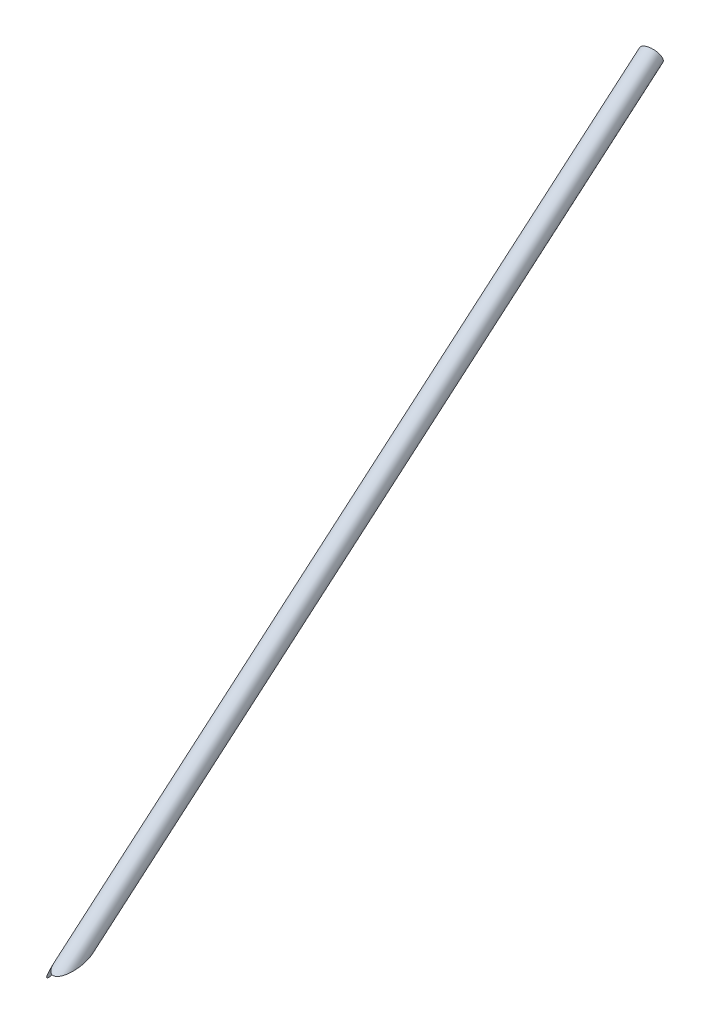
ISO-10303-21;
HEADER;
FILE_DESCRIPTION(('STEP AP214'),'2;1');
FILE_NAME('part.step','',(''),(''),'','','');
FILE_SCHEMA(('AUTOMOTIVE_DESIGN { 1 0 10303 214 1 1 1 1 }'));
ENDSEC;
DATA;
#1=APPLICATION_CONTEXT('core data for automotive mechanical design processes');
#2=APPLICATION_PROTOCOL_DEFINITION('international standard','automotive_design',2000,#1);
#3=PRODUCT_CONTEXT('',#1,'mechanical');
#4=PRODUCT('Part','Part','',(#3));
#5=PRODUCT_RELATED_PRODUCT_CATEGORY('part','',(#4));
#6=PRODUCT_DEFINITION_FORMATION('','',#4);
#7=PRODUCT_DEFINITION_CONTEXT('part definition',#1,'design');
#8=PRODUCT_DEFINITION('design','',#6,#7);
#9=PRODUCT_DEFINITION_SHAPE('','',#8);
#10=(LENGTH_UNIT() NAMED_UNIT(*) SI_UNIT(.MILLI.,.METRE.));
#11=(NAMED_UNIT(*) PLANE_ANGLE_UNIT() SI_UNIT($,.RADIAN.));
#12=(NAMED_UNIT(*) SI_UNIT($,.STERADIAN.) SOLID_ANGLE_UNIT());
#13=UNCERTAINTY_MEASURE_WITH_UNIT(LENGTH_MEASURE(1.E-05),#10,'distance_accuracy_value','');
#14=(GEOMETRIC_REPRESENTATION_CONTEXT(3) GLOBAL_UNCERTAINTY_ASSIGNED_CONTEXT((#13)) GLOBAL_UNIT_ASSIGNED_CONTEXT((#10,
#11,#12)) REPRESENTATION_CONTEXT('',''));
#15=CARTESIAN_POINT('',(0.,0.,0.));
#16=DIRECTION('',(0.,0.,1.));
#17=DIRECTION('',(1.,0.,0.));
#18=AXIS2_PLACEMENT_3D('',#15,#16,#17);
#19=CARTESIAN_POINT('',(-325.,320.,-1580.));
#20=DIRECTION('',(0.208710809439999,-0.381642622975999,0.900438063583998));
#21=DIRECTION('',(0.,-0.920714591276893,-0.390236647958419));
#22=AXIS2_PLACEMENT_3D('',#19,#20,#21);
#23=CYLINDRICAL_SURFACE('',#22,7.90000000000002);
#24=CARTESIAN_POINT('',(-169.854654537304,36.3056540110697,-910.658652432369));
#25=DIRECTION('',(0.993532672656404,0.,-0.113546591160732));
#26=DIRECTION('',(0.104852236740751,-0.383768850271771,0.917457071481573));
#27=AXIS2_PLACEMENT_3D('',#24,#25,#26);
#28=ELLIPSE('',#27,75.1526819648488,7.90000000000002);
#29=CARTESIAN_POINT('',(-162.115990749985,10.,-842.94534429332));
#30=VERTEX_POINT('',#29);
#31=CARTESIAN_POINT('',(-164.232637393376,10.,-861.466002422997));
#32=VERTEX_POINT('',#31);
#33=EDGE_CURVE('E57',#30,#32,#28,.T.);
#34=ORIENTED_EDGE('',*,*,#33,.T.);
#35=CARTESIAN_POINT('',(-155.468750000001,10.,-848.593750000001));
#36=DIRECTION('',(0.,-1.,0.));
#37=DIRECTION('',(0.225801752353741,0.,0.974173274440425));
#38=AXIS2_PLACEMENT_3D('',#35,#36,#37);
#39=ELLIPSE('',#38,20.6999939849403,7.90000000000002);
#40=EDGE_CURVE('E77',#32,#30,#39,.T.);
#41=ORIENTED_EDGE('',*,*,#40,.T.);
#42=EDGE_LOOP('',(#34,#41));
#43=FACE_BOUND('',#42,.T.);
#44=CARTESIAN_POINT('',(-325.,320.,-1580.));
#45=DIRECTION('',(-0.208710809439999,0.381642622975999,-0.900438063583998));
#46=DIRECTION('',(0.626062072534467,-0.655192350751652,-0.422811145608027));
#47=AXIS2_PLACEMENT_3D('',#44,#45,#46);
#48=CIRCLE('',#47,7.90000000000002);
#49=CARTESIAN_POINT('',(-320.054109626978,314.823980429062,-1583.3402080503));
#50=VERTEX_POINT('',#49);
#51=EDGE_CURVE('E43',#50,#50,#48,.T.);
#52=ORIENTED_EDGE('',*,*,#51,.T.);
#53=EDGE_LOOP('',(#52));
#54=FACE_BOUND('',#53,.T.);
#55=ADVANCED_FACE('F39',(#43,#54),#23,.F.);
#56=CARTESIAN_POINT('',(-325.,320.,-1580.));
#57=DIRECTION('',(0.208710809439999,-0.381642622975999,0.900438063583998));
#58=DIRECTION('',(0.,-0.920714591276893,-0.390236647958419));
#59=AXIS2_PLACEMENT_3D('',#56,#57,#58);
#60=CYLINDRICAL_SURFACE('',#59,9.49999999999999);
#61=CARTESIAN_POINT('',(-155.468750000001,10.,-848.593750000001));
#62=DIRECTION('',(0.,-1.,0.));
#63=DIRECTION('',(0.225801752353741,0.,0.974173274440425));
#64=AXIS2_PLACEMENT_3D('',#61,#62,#63);
#65=ELLIPSE('',#64,24.8923978299914,9.49999999999999);
#66=CARTESIAN_POINT('',(-165.021102330899,10.,-868.365070626323));
#67=VERTEX_POINT('',#66);
#68=CARTESIAN_POINT('',(-161.327525812462,10.,-836.046276089994));
#69=VERTEX_POINT('',#68);
#70=EDGE_CURVE('E49',#67,#69,#65,.T.);
#71=ORIENTED_EDGE('',*,*,#70,.F.);
#72=CARTESIAN_POINT('',(-169.854654537304,36.3056540110697,-910.658652432369));
#73=DIRECTION('',(0.993532672656404,0.,-0.113546591160732));
#74=DIRECTION('',(0.104852236740751,-0.383768850271771,0.917457071481573));
#75=AXIS2_PLACEMENT_3D('',#72,#73,#74);
#76=ELLIPSE('',#75,90.3734783121596,9.49999999999999);
#77=EDGE_CURVE('E66',#69,#67,#76,.T.);
#78=ORIENTED_EDGE('',*,*,#77,.F.);
#79=EDGE_LOOP('',(#71,#78));
#80=FACE_BOUND('',#79,.T.);
#81=CARTESIAN_POINT('',(-325.,320.,-1580.));
#82=DIRECTION('',(-0.208710809439999,0.381642622975999,-0.900438063583998));
#83=DIRECTION('',(0.,0.920714591276894,0.390236647958418));
#84=AXIS2_PLACEMENT_3D('',#81,#82,#83);
#85=CIRCLE('',#84,9.49999999999999);
#86=CARTESIAN_POINT('',(-325.,328.74678861713,-1576.2927518444));
#87=VERTEX_POINT('',#86);
#88=EDGE_CURVE('E11',#87,#87,#85,.T.);
#89=ORIENTED_EDGE('',*,*,#88,.F.);
#90=EDGE_LOOP('',(#89));
#91=FACE_BOUND('',#90,.T.);
#92=ADVANCED_FACE('F78',(#80,#91),#60,.T.);
#93=CARTESIAN_POINT('',(-259.935326726564,-10.,-1698.86453408839));
#94=DIRECTION('',(0.993532672656404,0.,-0.113546591160732));
#95=DIRECTION('',(-0.113546591160732,0.,-0.993532672656404));
#96=AXIS2_PLACEMENT_3D('',#93,#94,#95);
#97=PLANE('',#96);
#98=DIRECTION('',(0.113546591160732,0.,0.993532672656404));
#99=VECTOR('',#98,1.);
#100=CARTESIAN_POINT('',(-259.935326726564,10.,-1698.86453408839));
#101=LINE('',#100,#99);
#102=EDGE_CURVE('E63',#30,#69,#101,.T.);
#103=ORIENTED_EDGE('',*,*,#102,.T.);
#104=ORIENTED_EDGE('',*,*,#77,.T.);
#105=EDGE_CURVE('E69',#67,#32,#101,.T.);
#106=ORIENTED_EDGE('',*,*,#105,.T.);
#107=ORIENTED_EDGE('',*,*,#33,.F.);
#108=EDGE_LOOP('',(#103,#104,#106,#107));
#109=FACE_BOUND('',#108,.T.);
#110=ADVANCED_FACE('F68',(#109),#97,.T.);
#111=CARTESIAN_POINT('',(160.,10.,-825.));
#112=DIRECTION('',(0.,-1.,0.));
#113=DIRECTION('',(0.,0.,-1.));
#114=AXIS2_PLACEMENT_3D('',#111,#112,#113);
#115=PLANE('',#114);
#116=ORIENTED_EDGE('',*,*,#105,.F.);
#117=ORIENTED_EDGE('',*,*,#70,.T.);
#118=ORIENTED_EDGE('',*,*,#102,.F.);
#119=ORIENTED_EDGE('',*,*,#40,.F.);
#120=EDGE_LOOP('',(#116,#117,#118,#119));
#121=FACE_BOUND('',#120,.T.);
#122=ADVANCED_FACE('F75',(#121),#115,.T.);
#123=CARTESIAN_POINT('',(-325.,320.,-1580.));
#124=DIRECTION('',(-0.208710809439999,0.381642622975999,-0.900438063583998));
#125=DIRECTION('',(0.626062072534467,-0.655192350751652,-0.422811145608027));
#126=AXIS2_PLACEMENT_3D('',#123,#124,#125);
#127=PLANE('',#126);
#128=ORIENTED_EDGE('',*,*,#51,.F.);
#129=EDGE_LOOP('',(#128));
#130=FACE_BOUND('',#129,.T.);
#131=ORIENTED_EDGE('',*,*,#88,.T.);
#132=EDGE_LOOP('',(#131));
#133=FACE_BOUND('',#132,.T.);
#134=ADVANCED_FACE('F41',(#130,#133),#127,.T.);
#135=CLOSED_SHELL('',(#55,#92,#110,#122,#134));
#136=MANIFOLD_SOLID_BREP('B2',#135);
#137=ADVANCED_BREP_SHAPE_REPRESENTATION('',(#18,#136),#14);
#138=SHAPE_DEFINITION_REPRESENTATION(#9,#137);
ENDSEC;
END-ISO-10303-21;
